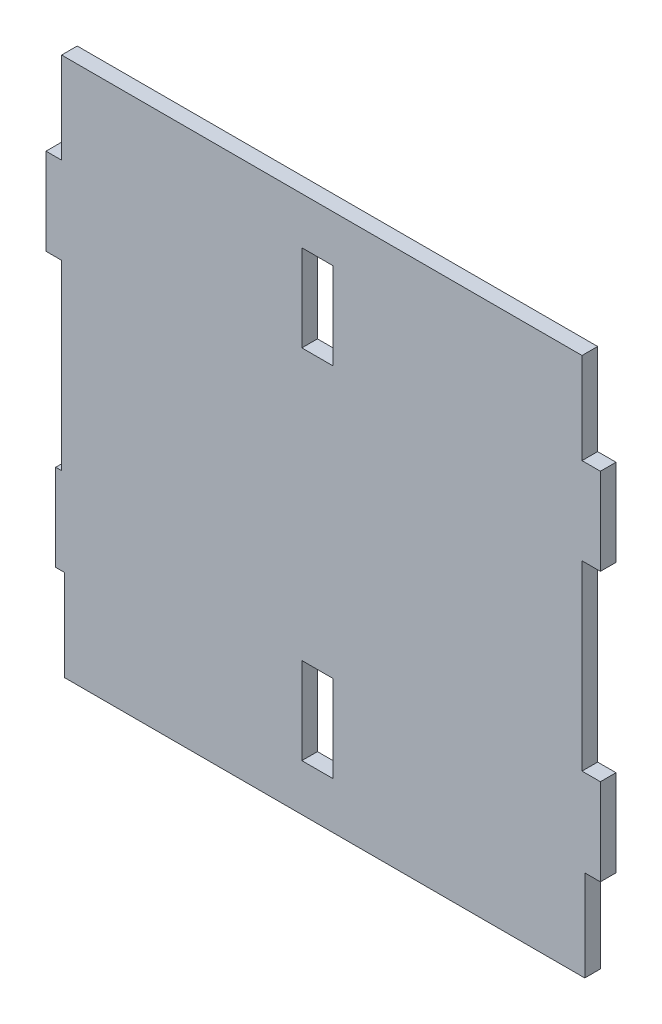
ISO-10303-21;
HEADER;
FILE_DESCRIPTION(('STEP AP214'),'2;1');
FILE_NAME('part.step','',(''),(''),'','','');
FILE_SCHEMA(('AUTOMOTIVE_DESIGN { 1 0 10303 214 1 1 1 1 }'));
ENDSEC;
DATA;
#1=APPLICATION_CONTEXT('core data for automotive mechanical design processes');
#2=APPLICATION_PROTOCOL_DEFINITION('international standard','automotive_design',2000,#1);
#3=PRODUCT_CONTEXT('',#1,'mechanical');
#4=PRODUCT('Part','Part','',(#3));
#5=PRODUCT_RELATED_PRODUCT_CATEGORY('part','',(#4));
#6=PRODUCT_DEFINITION_FORMATION('','',#4);
#7=PRODUCT_DEFINITION_CONTEXT('part definition',#1,'design');
#8=PRODUCT_DEFINITION('design','',#6,#7);
#9=PRODUCT_DEFINITION_SHAPE('','',#8);
#10=(LENGTH_UNIT() NAMED_UNIT(*) SI_UNIT(.MILLI.,.METRE.));
#11=(NAMED_UNIT(*) PLANE_ANGLE_UNIT() SI_UNIT($,.RADIAN.));
#12=(NAMED_UNIT(*) SI_UNIT($,.STERADIAN.) SOLID_ANGLE_UNIT());
#13=UNCERTAINTY_MEASURE_WITH_UNIT(LENGTH_MEASURE(1.E-05),#10,'distance_accuracy_value','');
#14=(GEOMETRIC_REPRESENTATION_CONTEXT(3) GLOBAL_UNCERTAINTY_ASSIGNED_CONTEXT((#13)) GLOBAL_UNIT_ASSIGNED_CONTEXT((#10,
#11,#12)) REPRESENTATION_CONTEXT('',''));
#15=CARTESIAN_POINT('',(0.,0.,0.));
#16=DIRECTION('',(0.,0.,1.));
#17=DIRECTION('',(1.,0.,0.));
#18=AXIS2_PLACEMENT_3D('',#15,#16,#17);
#19=CARTESIAN_POINT('',(0.,0.,18.));
#20=DIRECTION('',(0.,0.,1.));
#21=DIRECTION('',(1.,0.,0.));
#22=AXIS2_PLACEMENT_3D('',#19,#20,#21);
#23=PLANE('',#22);
#24=DIRECTION('',(-1.,0.,0.));
#25=VECTOR('',#24,1.);
#26=CARTESIAN_POINT('',(312.972181327121,-566.059001210979,18.));
#27=LINE('',#26,#25);
#28=CARTESIAN_POINT('',(312.972181327121,-566.059001210979,18.));
#29=VERTEX_POINT('',#28);
#30=CARTESIAN_POINT('',(276.972181327121,-566.059001210979,18.));
#31=VERTEX_POINT('',#30);
#32=EDGE_CURVE('E233',#29,#31,#27,.T.);
#33=ORIENTED_EDGE('',*,*,#32,.T.);
#34=DIRECTION('',(0.,1.,0.));
#35=VECTOR('',#34,1.);
#36=CARTESIAN_POINT('',(276.972181327121,-566.059001210979,18.));
#37=LINE('',#36,#35);
#38=CARTESIAN_POINT('',(276.972181327121,-466.059001210979,18.));
#39=VERTEX_POINT('',#38);
#40=EDGE_CURVE('E264',#31,#39,#37,.T.);
#41=ORIENTED_EDGE('',*,*,#40,.T.);
#42=DIRECTION('',(1.,0.,0.));
#43=VECTOR('',#42,1.);
#44=CARTESIAN_POINT('',(276.972181327121,-466.059001210979,18.));
#45=LINE('',#44,#43);
#46=CARTESIAN_POINT('',(312.972181327121,-466.059001210979,18.));
#47=VERTEX_POINT('',#46);
#48=EDGE_CURVE('E56',#39,#47,#45,.T.);
#49=ORIENTED_EDGE('',*,*,#48,.T.);
#50=DIRECTION('',(0.,1.,0.));
#51=VECTOR('',#50,1.);
#52=CARTESIAN_POINT('',(312.972181327121,-566.059001210979,18.));
#53=LINE('',#52,#51);
#54=EDGE_CURVE('E253',#29,#47,#53,.T.);
#55=ORIENTED_EDGE('',*,*,#54,.F.);
#56=EDGE_LOOP('',(#33,#41,#49,#55));
#57=FACE_BOUND('',#56,.T.);
#58=DIRECTION('',(0.,-1.,0.));
#59=VECTOR('',#58,1.);
#60=CARTESIAN_POINT('',(0.,0.,18.));
#61=LINE('',#60,#59);
#62=CARTESIAN_POINT('',(0.,0.,18.));
#63=VERTEX_POINT('',#62);
#64=CARTESIAN_POINT('',(0.,-105.,18.));
#65=VERTEX_POINT('',#64);
#66=EDGE_CURVE('E269',#63,#65,#61,.T.);
#67=ORIENTED_EDGE('',*,*,#66,.T.);
#68=DIRECTION('',(1.,0.,0.));
#69=VECTOR('',#68,1.);
#70=CARTESIAN_POINT('',(-18.,-105.,18.));
#71=LINE('',#70,#69);
#72=CARTESIAN_POINT('',(-18.,-105.,18.));
#73=VERTEX_POINT('',#72);
#74=EDGE_CURVE('E271',#73,#65,#71,.T.);
#75=ORIENTED_EDGE('',*,*,#74,.F.);
#76=DIRECTION('',(0.,-1.,0.));
#77=VECTOR('',#76,1.);
#78=CARTESIAN_POINT('',(-18.,-105.,18.));
#79=LINE('',#78,#77);
#80=CARTESIAN_POINT('',(-18.,-205.,18.));
#81=VERTEX_POINT('',#80);
#82=EDGE_CURVE('E275',#73,#81,#79,.T.);
#83=ORIENTED_EDGE('',*,*,#82,.T.);
#84=DIRECTION('',(1.,0.,0.));
#85=VECTOR('',#84,1.);
#86=CARTESIAN_POINT('',(-18.,-205.,18.));
#87=LINE('',#86,#85);
#88=CARTESIAN_POINT('',(0.,-205.,18.));
#89=VERTEX_POINT('',#88);
#90=EDGE_CURVE('E277',#81,#89,#87,.T.);
#91=ORIENTED_EDGE('',*,*,#90,.T.);
#92=DIRECTION('',(0.,-1.,0.));
#93=VECTOR('',#92,1.);
#94=CARTESIAN_POINT('',(0.,-205.,18.));
#95=LINE('',#94,#93);
#96=CARTESIAN_POINT('',(0.,-415.,18.));
#97=VERTEX_POINT('',#96);
#98=EDGE_CURVE('E279',#89,#97,#95,.T.);
#99=ORIENTED_EDGE('',*,*,#98,.T.);
#100=DIRECTION('',(1.,0.,0.));
#101=VECTOR('',#100,1.);
#102=CARTESIAN_POINT('',(-6.78008115735189,-415.,18.));
#103=LINE('',#102,#101);
#104=CARTESIAN_POINT('',(-6.78008115735189,-415.,18.));
#105=VERTEX_POINT('',#104);
#106=EDGE_CURVE('E281',#105,#97,#103,.T.);
#107=ORIENTED_EDGE('',*,*,#106,.F.);
#108=DIRECTION('',(0.,1.,0.));
#109=VECTOR('',#108,1.);
#110=CARTESIAN_POINT('',(-6.78008115735189,-515.,18.));
#111=LINE('',#110,#109);
#112=CARTESIAN_POINT('',(-6.78008115735189,-515.,18.));
#113=VERTEX_POINT('',#112);
#114=EDGE_CURVE('E284',#113,#105,#111,.T.);
#115=ORIENTED_EDGE('',*,*,#114,.F.);
#116=DIRECTION('',(0.999999666137457,0.000817144402291925,0.));
#117=VECTOR('',#116,1.);
#118=CARTESIAN_POINT('',(-6.78008115735189,-515.,18.));
#119=LINE('',#118,#117);
#120=CARTESIAN_POINT('',(3.17619678100274,-514.991864280499,18.));
#121=VERTEX_POINT('',#120);
#122=EDGE_CURVE('E287',#113,#121,#119,.T.);
#123=ORIENTED_EDGE('',*,*,#122,.T.);
#124=DIRECTION('',(0.,1.,0.));
#125=VECTOR('',#124,1.);
#126=CARTESIAN_POINT('',(3.17619678100274,-619.991864280499,18.));
#127=LINE('',#126,#125);
#128=CARTESIAN_POINT('',(3.17619678100274,-619.991864280499,18.));
#129=VERTEX_POINT('',#128);
#130=EDGE_CURVE('E289',#129,#121,#127,.T.);
#131=ORIENTED_EDGE('',*,*,#130,.F.);
#132=DIRECTION('',(1.,0.,0.));
#133=VECTOR('',#132,1.);
#134=CARTESIAN_POINT('',(3.17619678100274,-619.991864280499,18.));
#135=LINE('',#134,#133);
#136=CARTESIAN_POINT('',(603.176196781003,-619.991864280499,18.));
#137=VERTEX_POINT('',#136);
#138=EDGE_CURVE('E292',#129,#137,#135,.T.);
#139=ORIENTED_EDGE('',*,*,#138,.T.);
#140=DIRECTION('',(0.,1.,0.));
#141=VECTOR('',#140,1.);
#142=CARTESIAN_POINT('',(603.176196781003,-619.991864280499,18.));
#143=LINE('',#142,#141);
#144=CARTESIAN_POINT('',(603.176196781003,-515.,18.));
#145=VERTEX_POINT('',#144);
#146=EDGE_CURVE('E294',#137,#145,#143,.T.);
#147=ORIENTED_EDGE('',*,*,#146,.T.);
#148=DIRECTION('',(-1.,0.,0.));
#149=VECTOR('',#148,1.);
#150=CARTESIAN_POINT('',(621.176196781003,-515.,18.));
#151=LINE('',#150,#149);
#152=CARTESIAN_POINT('',(621.176196781003,-515.,18.));
#153=VERTEX_POINT('',#152);
#154=EDGE_CURVE('E296',#153,#145,#151,.T.);
#155=ORIENTED_EDGE('',*,*,#154,.F.);
#156=DIRECTION('',(0.,1.,0.));
#157=VECTOR('',#156,1.);
#158=CARTESIAN_POINT('',(621.176196781003,-515.,18.));
#159=LINE('',#158,#157);
#160=CARTESIAN_POINT('',(621.176196781003,-415.,18.));
#161=VERTEX_POINT('',#160);
#162=EDGE_CURVE('E299',#153,#161,#159,.T.);
#163=ORIENTED_EDGE('',*,*,#162,.T.);
#164=DIRECTION('',(-1.,0.,0.));
#165=VECTOR('',#164,1.);
#166=CARTESIAN_POINT('',(621.176196781003,-415.,18.));
#167=LINE('',#166,#165);
#168=CARTESIAN_POINT('',(600.,-415.,18.));
#169=VERTEX_POINT('',#168);
#170=EDGE_CURVE('E301',#161,#169,#167,.T.);
#171=ORIENTED_EDGE('',*,*,#170,.T.);
#172=DIRECTION('',(0.,-1.,0.));
#173=VECTOR('',#172,1.);
#174=CARTESIAN_POINT('',(600.,-205.,18.));
#175=LINE('',#174,#173);
#176=CARTESIAN_POINT('',(600.,-205.,18.));
#177=VERTEX_POINT('',#176);
#178=EDGE_CURVE('E303',#177,#169,#175,.T.);
#179=ORIENTED_EDGE('',*,*,#178,.F.);
#180=DIRECTION('',(-1.,0.,0.));
#181=VECTOR('',#180,1.);
#182=CARTESIAN_POINT('',(621.176196781003,-205.,18.));
#183=LINE('',#182,#181);
#184=CARTESIAN_POINT('',(621.176196781003,-205.,18.));
#185=VERTEX_POINT('',#184);
#186=EDGE_CURVE('E306',#185,#177,#183,.T.);
#187=ORIENTED_EDGE('',*,*,#186,.F.);
#188=DIRECTION('',(0.,-1.,0.));
#189=VECTOR('',#188,1.);
#190=CARTESIAN_POINT('',(621.176196781003,-105.,18.));
#191=LINE('',#190,#189);
#192=CARTESIAN_POINT('',(621.176196781003,-105.,18.));
#193=VERTEX_POINT('',#192);
#194=EDGE_CURVE('E309',#193,#185,#191,.T.);
#195=ORIENTED_EDGE('',*,*,#194,.F.);
#196=DIRECTION('',(-1.,0.,0.));
#197=VECTOR('',#196,1.);
#198=CARTESIAN_POINT('',(621.176196781003,-105.,18.));
#199=LINE('',#198,#197);
#200=CARTESIAN_POINT('',(600.,-105.,18.));
#201=VERTEX_POINT('',#200);
#202=EDGE_CURVE('E312',#193,#201,#199,.T.);
#203=ORIENTED_EDGE('',*,*,#202,.T.);
#204=DIRECTION('',(0.,-1.,0.));
#205=VECTOR('',#204,1.);
#206=CARTESIAN_POINT('',(600.,0.,18.));
#207=LINE('',#206,#205);
#208=CARTESIAN_POINT('',(600.,0.,18.));
#209=VERTEX_POINT('',#208);
#210=EDGE_CURVE('E314',#209,#201,#207,.T.);
#211=ORIENTED_EDGE('',*,*,#210,.F.);
#212=DIRECTION('',(-1.,0.,0.));
#213=VECTOR('',#212,1.);
#214=CARTESIAN_POINT('',(600.,0.,18.));
#215=LINE('',#214,#213);
#216=EDGE_CURVE('E317',#209,#63,#215,.T.);
#217=ORIENTED_EDGE('',*,*,#216,.T.);
#218=EDGE_LOOP('',(#67,#75,#83,#91,#99,#107,#115,#123,#131,#139,#147,#155,#163,#171,#179,#187,
#195,#203,#211,#217));
#219=FACE_BOUND('',#218,.T.);
#220=DIRECTION('',(1.,0.,0.));
#221=VECTOR('',#220,1.);
#222=CARTESIAN_POINT('',(276.972181327121,-153.940998789021,18.));
#223=LINE('',#222,#221);
#224=CARTESIAN_POINT('',(276.972181327121,-153.940998789021,18.));
#225=VERTEX_POINT('',#224);
#226=CARTESIAN_POINT('',(312.972181327121,-153.940998789021,18.));
#227=VERTEX_POINT('',#226);
#228=EDGE_CURVE('E232',#225,#227,#223,.T.);
#229=ORIENTED_EDGE('',*,*,#228,.F.);
#230=DIRECTION('',(0.,-1.,0.));
#231=VECTOR('',#230,1.);
#232=CARTESIAN_POINT('',(276.972181327121,-53.9409987890207,18.));
#233=LINE('',#232,#231);
#234=CARTESIAN_POINT('',(276.972181327121,-53.9409987890207,18.));
#235=VERTEX_POINT('',#234);
#236=EDGE_CURVE('E223',#235,#225,#233,.T.);
#237=ORIENTED_EDGE('',*,*,#236,.F.);
#238=DIRECTION('',(-1.,0.,0.));
#239=VECTOR('',#238,1.);
#240=CARTESIAN_POINT('',(312.972181327121,-53.9409987890207,18.));
#241=LINE('',#240,#239);
#242=CARTESIAN_POINT('',(312.972181327121,-53.9409987890207,18.));
#243=VERTEX_POINT('',#242);
#244=EDGE_CURVE('E243',#243,#235,#241,.T.);
#245=ORIENTED_EDGE('',*,*,#244,.F.);
#246=DIRECTION('',(0.,-1.,0.));
#247=VECTOR('',#246,1.);
#248=CARTESIAN_POINT('',(312.972181327121,-53.9409987890207,18.));
#249=LINE('',#248,#247);
#250=EDGE_CURVE('E48',#243,#227,#249,.T.);
#251=ORIENTED_EDGE('',*,*,#250,.T.);
#252=EDGE_LOOP('',(#229,#237,#245,#251));
#253=FACE_BOUND('',#252,.T.);
#254=ADVANCED_FACE('F33',(#57,#219,#253),#23,.T.);
#255=CARTESIAN_POINT('',(0.,0.,0.));
#256=DIRECTION('',(0.,0.,1.));
#257=DIRECTION('',(1.,0.,0.));
#258=AXIS2_PLACEMENT_3D('',#255,#256,#257);
#259=PLANE('',#258);
#260=DIRECTION('',(0.,-1.,0.));
#261=VECTOR('',#260,1.);
#262=CARTESIAN_POINT('',(0.,0.,0.));
#263=LINE('',#262,#261);
#264=CARTESIAN_POINT('',(0.,0.,0.));
#265=VERTEX_POINT('',#264);
#266=CARTESIAN_POINT('',(0.,-105.,0.));
#267=VERTEX_POINT('',#266);
#268=EDGE_CURVE('E239',#265,#267,#263,.T.);
#269=ORIENTED_EDGE('',*,*,#268,.F.);
#270=DIRECTION('',(-1.,0.,0.));
#271=VECTOR('',#270,1.);
#272=CARTESIAN_POINT('',(600.,0.,0.));
#273=LINE('',#272,#271);
#274=CARTESIAN_POINT('',(600.,0.,0.));
#275=VERTEX_POINT('',#274);
#276=EDGE_CURVE('E272',#275,#265,#273,.T.);
#277=ORIENTED_EDGE('',*,*,#276,.F.);
#278=DIRECTION('',(0.,-1.,0.));
#279=VECTOR('',#278,1.);
#280=CARTESIAN_POINT('',(600.,0.,0.));
#281=LINE('',#280,#279);
#282=CARTESIAN_POINT('',(600.,-105.,0.));
#283=VERTEX_POINT('',#282);
#284=EDGE_CURVE('E369',#275,#283,#281,.T.);
#285=ORIENTED_EDGE('',*,*,#284,.T.);
#286=DIRECTION('',(-1.,0.,0.));
#287=VECTOR('',#286,1.);
#288=CARTESIAN_POINT('',(621.176196781003,-105.,0.));
#289=LINE('',#288,#287);
#290=CARTESIAN_POINT('',(621.176196781003,-105.,0.));
#291=VERTEX_POINT('',#290);
#292=EDGE_CURVE('E366',#291,#283,#289,.T.);
#293=ORIENTED_EDGE('',*,*,#292,.F.);
#294=DIRECTION('',(0.,-1.,0.));
#295=VECTOR('',#294,1.);
#296=CARTESIAN_POINT('',(621.176196781003,-105.,0.));
#297=LINE('',#296,#295);
#298=CARTESIAN_POINT('',(621.176196781003,-205.,0.));
#299=VERTEX_POINT('',#298);
#300=EDGE_CURVE('E363',#291,#299,#297,.T.);
#301=ORIENTED_EDGE('',*,*,#300,.T.);
#302=DIRECTION('',(-1.,0.,0.));
#303=VECTOR('',#302,1.);
#304=CARTESIAN_POINT('',(621.176196781003,-205.,0.));
#305=LINE('',#304,#303);
#306=CARTESIAN_POINT('',(600.,-205.,0.));
#307=VERTEX_POINT('',#306);
#308=EDGE_CURVE('E360',#299,#307,#305,.T.);
#309=ORIENTED_EDGE('',*,*,#308,.T.);
#310=DIRECTION('',(0.,-1.,0.));
#311=VECTOR('',#310,1.);
#312=CARTESIAN_POINT('',(600.,-205.,0.));
#313=LINE('',#312,#311);
#314=CARTESIAN_POINT('',(600.,-415.,0.));
#315=VERTEX_POINT('',#314);
#316=EDGE_CURVE('E357',#307,#315,#313,.T.);
#317=ORIENTED_EDGE('',*,*,#316,.T.);
#318=DIRECTION('',(-1.,0.,0.));
#319=VECTOR('',#318,1.);
#320=CARTESIAN_POINT('',(621.176196781003,-415.,0.));
#321=LINE('',#320,#319);
#322=CARTESIAN_POINT('',(621.176196781003,-415.,0.));
#323=VERTEX_POINT('',#322);
#324=EDGE_CURVE('E354',#323,#315,#321,.T.);
#325=ORIENTED_EDGE('',*,*,#324,.F.);
#326=DIRECTION('',(0.,1.,0.));
#327=VECTOR('',#326,1.);
#328=CARTESIAN_POINT('',(621.176196781003,-515.,0.));
#329=LINE('',#328,#327);
#330=CARTESIAN_POINT('',(621.176196781003,-515.,0.));
#331=VERTEX_POINT('',#330);
#332=EDGE_CURVE('E352',#331,#323,#329,.T.);
#333=ORIENTED_EDGE('',*,*,#332,.F.);
#334=DIRECTION('',(-1.,0.,0.));
#335=VECTOR('',#334,1.);
#336=CARTESIAN_POINT('',(621.176196781003,-515.,0.));
#337=LINE('',#336,#335);
#338=CARTESIAN_POINT('',(603.176196781003,-515.,0.));
#339=VERTEX_POINT('',#338);
#340=EDGE_CURVE('E349',#331,#339,#337,.T.);
#341=ORIENTED_EDGE('',*,*,#340,.T.);
#342=DIRECTION('',(0.,1.,0.));
#343=VECTOR('',#342,1.);
#344=CARTESIAN_POINT('',(603.176196781003,-619.991864280499,0.));
#345=LINE('',#344,#343);
#346=CARTESIAN_POINT('',(603.176196781003,-619.991864280499,0.));
#347=VERTEX_POINT('',#346);
#348=EDGE_CURVE('E346',#347,#339,#345,.T.);
#349=ORIENTED_EDGE('',*,*,#348,.F.);
#350=DIRECTION('',(1.,0.,0.));
#351=VECTOR('',#350,1.);
#352=CARTESIAN_POINT('',(3.17619678100274,-619.991864280499,0.));
#353=LINE('',#352,#351);
#354=CARTESIAN_POINT('',(3.17619678100274,-619.991864280499,0.));
#355=VERTEX_POINT('',#354);
#356=EDGE_CURVE('E344',#355,#347,#353,.T.);
#357=ORIENTED_EDGE('',*,*,#356,.F.);
#358=DIRECTION('',(0.,1.,0.));
#359=VECTOR('',#358,1.);
#360=CARTESIAN_POINT('',(3.17619678100274,-619.991864280499,0.));
#361=LINE('',#360,#359);
#362=CARTESIAN_POINT('',(3.17619678100274,-514.991864280499,0.));
#363=VERTEX_POINT('',#362);
#364=EDGE_CURVE('E341',#355,#363,#361,.T.);
#365=ORIENTED_EDGE('',*,*,#364,.T.);
#366=DIRECTION('',(0.999999666137457,0.000817144402291925,0.));
#367=VECTOR('',#366,1.);
#368=CARTESIAN_POINT('',(-6.78008115735189,-515.,0.));
#369=LINE('',#368,#367);
#370=CARTESIAN_POINT('',(-6.78008115735189,-515.,0.));
#371=VERTEX_POINT('',#370);
#372=EDGE_CURVE('E338',#371,#363,#369,.T.);
#373=ORIENTED_EDGE('',*,*,#372,.F.);
#374=DIRECTION('',(0.,1.,0.));
#375=VECTOR('',#374,1.);
#376=CARTESIAN_POINT('',(-6.78008115735189,-515.,0.));
#377=LINE('',#376,#375);
#378=CARTESIAN_POINT('',(-6.78008115735189,-415.,0.));
#379=VERTEX_POINT('',#378);
#380=EDGE_CURVE('E335',#371,#379,#377,.T.);
#381=ORIENTED_EDGE('',*,*,#380,.T.);
#382=DIRECTION('',(1.,0.,0.));
#383=VECTOR('',#382,1.);
#384=CARTESIAN_POINT('',(-6.78008115735189,-415.,0.));
#385=LINE('',#384,#383);
#386=CARTESIAN_POINT('',(0.,-415.,0.));
#387=VERTEX_POINT('',#386);
#388=EDGE_CURVE('E332',#379,#387,#385,.T.);
#389=ORIENTED_EDGE('',*,*,#388,.T.);
#390=DIRECTION('',(0.,-1.,0.));
#391=VECTOR('',#390,1.);
#392=CARTESIAN_POINT('',(0.,-205.,0.));
#393=LINE('',#392,#391);
#394=CARTESIAN_POINT('',(0.,-205.,0.));
#395=VERTEX_POINT('',#394);
#396=EDGE_CURVE('E329',#395,#387,#393,.T.);
#397=ORIENTED_EDGE('',*,*,#396,.F.);
#398=DIRECTION('',(1.,0.,0.));
#399=VECTOR('',#398,1.);
#400=CARTESIAN_POINT('',(-18.,-205.,0.));
#401=LINE('',#400,#399);
#402=CARTESIAN_POINT('',(-18.,-205.,0.));
#403=VERTEX_POINT('',#402);
#404=EDGE_CURVE('E327',#403,#395,#401,.T.);
#405=ORIENTED_EDGE('',*,*,#404,.F.);
#406=DIRECTION('',(0.,-1.,0.));
#407=VECTOR('',#406,1.);
#408=CARTESIAN_POINT('',(-18.,-105.,0.));
#409=LINE('',#408,#407);
#410=CARTESIAN_POINT('',(-18.,-105.,0.));
#411=VERTEX_POINT('',#410);
#412=EDGE_CURVE('E325',#411,#403,#409,.T.);
#413=ORIENTED_EDGE('',*,*,#412,.F.);
#414=DIRECTION('',(1.,0.,0.));
#415=VECTOR('',#414,1.);
#416=CARTESIAN_POINT('',(-18.,-105.,0.));
#417=LINE('',#416,#415);
#418=EDGE_CURVE('E322',#411,#267,#417,.T.);
#419=ORIENTED_EDGE('',*,*,#418,.T.);
#420=EDGE_LOOP('',(#269,#277,#285,#293,#301,#309,#317,#325,#333,#341,#349,#357,#365,#373,#381,
#389,#397,#405,#413,#419));
#421=FACE_BOUND('',#420,.T.);
#422=DIRECTION('',(0.,-1.,0.));
#423=VECTOR('',#422,1.);
#424=CARTESIAN_POINT('',(276.972181327121,0.,0.));
#425=LINE('',#424,#423);
#426=CARTESIAN_POINT('',(276.972181327121,-466.059001210979,0.));
#427=VERTEX_POINT('',#426);
#428=CARTESIAN_POINT('',(276.972181327121,-566.059001210979,0.));
#429=VERTEX_POINT('',#428);
#430=EDGE_CURVE('E417',#427,#429,#425,.T.);
#431=ORIENTED_EDGE('',*,*,#430,.T.);
#432=DIRECTION('',(1.,0.,0.));
#433=VECTOR('',#432,1.);
#434=CARTESIAN_POINT('',(0.,-566.059001210979,0.));
#435=LINE('',#434,#433);
#436=CARTESIAN_POINT('',(312.972181327121,-566.059001210979,0.));
#437=VERTEX_POINT('',#436);
#438=EDGE_CURVE('E425',#429,#437,#435,.T.);
#439=ORIENTED_EDGE('',*,*,#438,.T.);
#440=DIRECTION('',(0.,-1.,0.));
#441=VECTOR('',#440,1.);
#442=CARTESIAN_POINT('',(312.972181327121,0.,0.));
#443=LINE('',#442,#441);
#444=CARTESIAN_POINT('',(312.972181327121,-466.059001210979,0.));
#445=VERTEX_POINT('',#444);
#446=EDGE_CURVE('E423',#445,#437,#443,.T.);
#447=ORIENTED_EDGE('',*,*,#446,.F.);
#448=DIRECTION('',(-1.,0.,0.));
#449=VECTOR('',#448,1.);
#450=CARTESIAN_POINT('',(0.,-466.059001210979,0.));
#451=LINE('',#450,#449);
#452=EDGE_CURVE('E420',#445,#427,#451,.T.);
#453=ORIENTED_EDGE('',*,*,#452,.T.);
#454=EDGE_LOOP('',(#431,#439,#447,#453));
#455=FACE_BOUND('',#454,.T.);
#456=DIRECTION('',(0.,1.,0.));
#457=VECTOR('',#456,1.);
#458=CARTESIAN_POINT('',(276.972181327121,0.,0.));
#459=LINE('',#458,#457);
#460=CARTESIAN_POINT('',(276.972181327121,-153.940998789021,0.));
#461=VERTEX_POINT('',#460);
#462=CARTESIAN_POINT('',(276.972181327121,-53.9409987890207,0.));
#463=VERTEX_POINT('',#462);
#464=EDGE_CURVE('E11',#461,#463,#459,.T.);
#465=ORIENTED_EDGE('',*,*,#464,.F.);
#466=DIRECTION('',(-1.,0.,0.));
#467=VECTOR('',#466,1.);
#468=CARTESIAN_POINT('',(0.,-153.940998789021,0.));
#469=LINE('',#468,#467);
#470=CARTESIAN_POINT('',(312.972181327121,-153.940998789021,0.));
#471=VERTEX_POINT('',#470);
#472=EDGE_CURVE('E41',#471,#461,#469,.T.);
#473=ORIENTED_EDGE('',*,*,#472,.F.);
#474=DIRECTION('',(0.,1.,0.));
#475=VECTOR('',#474,1.);
#476=CARTESIAN_POINT('',(312.972181327121,0.,0.));
#477=LINE('',#476,#475);
#478=CARTESIAN_POINT('',(312.972181327121,-53.9409987890207,0.));
#479=VERTEX_POINT('',#478);
#480=EDGE_CURVE('E430',#471,#479,#477,.T.);
#481=ORIENTED_EDGE('',*,*,#480,.T.);
#482=DIRECTION('',(1.,0.,0.));
#483=VECTOR('',#482,1.);
#484=CARTESIAN_POINT('',(0.,-53.9409987890207,0.));
#485=LINE('',#484,#483);
#486=EDGE_CURVE('E428',#463,#479,#485,.T.);
#487=ORIENTED_EDGE('',*,*,#486,.F.);
#488=EDGE_LOOP('',(#465,#473,#481,#487));
#489=FACE_BOUND('',#488,.T.);
#490=ADVANCED_FACE('F434',(#421,#455,#489),#259,.F.);
#491=CARTESIAN_POINT('',(0.,0.,18.));
#492=DIRECTION('',(1.,0.,0.));
#493=DIRECTION('',(0.,1.,0.));
#494=AXIS2_PLACEMENT_3D('',#491,#492,#493);
#495=PLANE('',#494);
#496=ORIENTED_EDGE('',*,*,#268,.T.);
#497=DIRECTION('',(0.,0.,-1.));
#498=VECTOR('',#497,1.);
#499=CARTESIAN_POINT('',(0.,-105.,18.));
#500=LINE('',#499,#498);
#501=EDGE_CURVE('E415',#65,#267,#500,.T.);
#502=ORIENTED_EDGE('',*,*,#501,.F.);
#503=ORIENTED_EDGE('',*,*,#66,.F.);
#504=DIRECTION('',(0.,0.,-1.));
#505=VECTOR('',#504,1.);
#506=CARTESIAN_POINT('',(0.,0.,18.));
#507=LINE('',#506,#505);
#508=EDGE_CURVE('E319',#63,#265,#507,.T.);
#509=ORIENTED_EDGE('',*,*,#508,.T.);
#510=EDGE_LOOP('',(#496,#502,#503,#509));
#511=FACE_BOUND('',#510,.T.);
#512=ADVANCED_FACE('F35',(#511),#495,.F.);
#513=CARTESIAN_POINT('',(-18.,-105.,18.));
#514=DIRECTION('',(0.,1.,0.));
#515=DIRECTION('',(0.,0.,1.));
#516=AXIS2_PLACEMENT_3D('',#513,#514,#515);
#517=PLANE('',#516);
#518=ORIENTED_EDGE('',*,*,#418,.F.);
#519=DIRECTION('',(0.,0.,-1.));
#520=VECTOR('',#519,1.);
#521=CARTESIAN_POINT('',(-18.,-105.,18.));
#522=LINE('',#521,#520);
#523=EDGE_CURVE('E413',#73,#411,#522,.T.);
#524=ORIENTED_EDGE('',*,*,#523,.F.);
#525=ORIENTED_EDGE('',*,*,#74,.T.);
#526=ORIENTED_EDGE('',*,*,#501,.T.);
#527=EDGE_LOOP('',(#518,#524,#525,#526));
#528=FACE_BOUND('',#527,.T.);
#529=ADVANCED_FACE('F528',(#528),#517,.T.);
#530=CARTESIAN_POINT('',(-18.,-105.,18.));
#531=DIRECTION('',(1.,0.,0.));
#532=DIRECTION('',(0.,1.,0.));
#533=AXIS2_PLACEMENT_3D('',#530,#531,#532);
#534=PLANE('',#533);
#535=ORIENTED_EDGE('',*,*,#412,.T.);
#536=DIRECTION('',(0.,0.,-1.));
#537=VECTOR('',#536,1.);
#538=CARTESIAN_POINT('',(-18.,-205.,18.));
#539=LINE('',#538,#537);
#540=EDGE_CURVE('E410',#81,#403,#539,.T.);
#541=ORIENTED_EDGE('',*,*,#540,.F.);
#542=ORIENTED_EDGE('',*,*,#82,.F.);
#543=ORIENTED_EDGE('',*,*,#523,.T.);
#544=EDGE_LOOP('',(#535,#541,#542,#543));
#545=FACE_BOUND('',#544,.T.);
#546=ADVANCED_FACE('F525',(#545),#534,.F.);
#547=CARTESIAN_POINT('',(-18.,-205.,18.));
#548=DIRECTION('',(0.,1.,0.));
#549=DIRECTION('',(0.,0.,1.));
#550=AXIS2_PLACEMENT_3D('',#547,#548,#549);
#551=PLANE('',#550);
#552=ORIENTED_EDGE('',*,*,#404,.T.);
#553=DIRECTION('',(0.,0.,-1.));
#554=VECTOR('',#553,1.);
#555=CARTESIAN_POINT('',(0.,-205.,18.));
#556=LINE('',#555,#554);
#557=EDGE_CURVE('E407',#89,#395,#556,.T.);
#558=ORIENTED_EDGE('',*,*,#557,.F.);
#559=ORIENTED_EDGE('',*,*,#90,.F.);
#560=ORIENTED_EDGE('',*,*,#540,.T.);
#561=EDGE_LOOP('',(#552,#558,#559,#560));
#562=FACE_BOUND('',#561,.T.);
#563=ADVANCED_FACE('F521',(#562),#551,.F.);
#564=CARTESIAN_POINT('',(0.,-205.,18.));
#565=DIRECTION('',(1.,0.,0.));
#566=DIRECTION('',(0.,1.,0.));
#567=AXIS2_PLACEMENT_3D('',#564,#565,#566);
#568=PLANE('',#567);
#569=ORIENTED_EDGE('',*,*,#396,.T.);
#570=DIRECTION('',(0.,0.,-1.));
#571=VECTOR('',#570,1.);
#572=CARTESIAN_POINT('',(0.,-415.,18.));
#573=LINE('',#572,#571);
#574=EDGE_CURVE('E405',#97,#387,#573,.T.);
#575=ORIENTED_EDGE('',*,*,#574,.F.);
#576=ORIENTED_EDGE('',*,*,#98,.F.);
#577=ORIENTED_EDGE('',*,*,#557,.T.);
#578=EDGE_LOOP('',(#569,#575,#576,#577));
#579=FACE_BOUND('',#578,.T.);
#580=ADVANCED_FACE('F517',(#579),#568,.F.);
#581=CARTESIAN_POINT('',(-6.78008115735189,-415.,18.));
#582=DIRECTION('',(0.,1.,0.));
#583=DIRECTION('',(0.,0.,1.));
#584=AXIS2_PLACEMENT_3D('',#581,#582,#583);
#585=PLANE('',#584);
#586=ORIENTED_EDGE('',*,*,#388,.F.);
#587=DIRECTION('',(0.,0.,-1.));
#588=VECTOR('',#587,1.);
#589=CARTESIAN_POINT('',(-6.78008115735189,-415.,18.));
#590=LINE('',#589,#588);
#591=EDGE_CURVE('E403',#105,#379,#590,.T.);
#592=ORIENTED_EDGE('',*,*,#591,.F.);
#593=ORIENTED_EDGE('',*,*,#106,.T.);
#594=ORIENTED_EDGE('',*,*,#574,.T.);
#595=EDGE_LOOP('',(#586,#592,#593,#594));
#596=FACE_BOUND('',#595,.T.);
#597=ADVANCED_FACE('F513',(#596),#585,.T.);
#598=CARTESIAN_POINT('',(-6.78008115735189,-515.,18.));
#599=DIRECTION('',(-1.,0.,0.));
#600=DIRECTION('',(0.,0.,1.));
#601=AXIS2_PLACEMENT_3D('',#598,#599,#600);
#602=PLANE('',#601);
#603=ORIENTED_EDGE('',*,*,#380,.F.);
#604=DIRECTION('',(0.,0.,-1.));
#605=VECTOR('',#604,1.);
#606=CARTESIAN_POINT('',(-6.78008115735189,-515.,18.));
#607=LINE('',#606,#605);
#608=EDGE_CURVE('E401',#113,#371,#607,.T.);
#609=ORIENTED_EDGE('',*,*,#608,.F.);
#610=ORIENTED_EDGE('',*,*,#114,.T.);
#611=ORIENTED_EDGE('',*,*,#591,.T.);
#612=EDGE_LOOP('',(#603,#609,#610,#611));
#613=FACE_BOUND('',#612,.T.);
#614=ADVANCED_FACE('F509',(#613),#602,.T.);
#615=CARTESIAN_POINT('',(-6.78008115735189,-515.,18.));
#616=DIRECTION('',(-0.000817144402291925,0.999999666137457,0.));
#617=DIRECTION('',(-0.999999666137457,-0.000817144402291925,0.));
#618=AXIS2_PLACEMENT_3D('',#615,#616,#617);
#619=PLANE('',#618);
#620=ORIENTED_EDGE('',*,*,#372,.T.);
#621=DIRECTION('',(0.,0.,-1.));
#622=VECTOR('',#621,1.);
#623=CARTESIAN_POINT('',(3.17619678100274,-514.991864280499,18.));
#624=LINE('',#623,#622);
#625=EDGE_CURVE('E399',#121,#363,#624,.T.);
#626=ORIENTED_EDGE('',*,*,#625,.F.);
#627=ORIENTED_EDGE('',*,*,#122,.F.);
#628=ORIENTED_EDGE('',*,*,#608,.T.);
#629=EDGE_LOOP('',(#620,#626,#627,#628));
#630=FACE_BOUND('',#629,.T.);
#631=ADVANCED_FACE('F505',(#630),#619,.F.);
#632=CARTESIAN_POINT('',(3.17619678100274,-619.991864280499,18.));
#633=DIRECTION('',(-1.,0.,0.));
#634=DIRECTION('',(0.,0.,1.));
#635=AXIS2_PLACEMENT_3D('',#632,#633,#634);
#636=PLANE('',#635);
#637=ORIENTED_EDGE('',*,*,#364,.F.);
#638=DIRECTION('',(0.,0.,-1.));
#639=VECTOR('',#638,1.);
#640=CARTESIAN_POINT('',(3.17619678100274,-619.991864280499,18.));
#641=LINE('',#640,#639);
#642=EDGE_CURVE('E397',#129,#355,#641,.T.);
#643=ORIENTED_EDGE('',*,*,#642,.F.);
#644=ORIENTED_EDGE('',*,*,#130,.T.);
#645=ORIENTED_EDGE('',*,*,#625,.T.);
#646=EDGE_LOOP('',(#637,#643,#644,#645));
#647=FACE_BOUND('',#646,.T.);
#648=ADVANCED_FACE('F501',(#647),#636,.T.);
#649=CARTESIAN_POINT('',(3.17619678100274,-619.991864280499,18.));
#650=DIRECTION('',(0.,1.,0.));
#651=DIRECTION('',(-1.,0.,0.));
#652=AXIS2_PLACEMENT_3D('',#649,#650,#651);
#653=PLANE('',#652);
#654=ORIENTED_EDGE('',*,*,#356,.T.);
#655=DIRECTION('',(0.,0.,-1.));
#656=VECTOR('',#655,1.);
#657=CARTESIAN_POINT('',(603.176196781003,-619.991864280499,18.));
#658=LINE('',#657,#656);
#659=EDGE_CURVE('E394',#137,#347,#658,.T.);
#660=ORIENTED_EDGE('',*,*,#659,.F.);
#661=ORIENTED_EDGE('',*,*,#138,.F.);
#662=ORIENTED_EDGE('',*,*,#642,.T.);
#663=EDGE_LOOP('',(#654,#660,#661,#662));
#664=FACE_BOUND('',#663,.T.);
#665=ADVANCED_FACE('F497',(#664),#653,.F.);
#666=CARTESIAN_POINT('',(603.176196781003,-619.991864280499,18.));
#667=DIRECTION('',(-1.,0.,0.));
#668=DIRECTION('',(0.,0.,1.));
#669=AXIS2_PLACEMENT_3D('',#666,#667,#668);
#670=PLANE('',#669);
#671=ORIENTED_EDGE('',*,*,#348,.T.);
#672=DIRECTION('',(0.,0.,-1.));
#673=VECTOR('',#672,1.);
#674=CARTESIAN_POINT('',(603.176196781003,-515.,18.));
#675=LINE('',#674,#673);
#676=EDGE_CURVE('E392',#145,#339,#675,.T.);
#677=ORIENTED_EDGE('',*,*,#676,.F.);
#678=ORIENTED_EDGE('',*,*,#146,.F.);
#679=ORIENTED_EDGE('',*,*,#659,.T.);
#680=EDGE_LOOP('',(#671,#677,#678,#679));
#681=FACE_BOUND('',#680,.T.);
#682=ADVANCED_FACE('F493',(#681),#670,.F.);
#683=CARTESIAN_POINT('',(621.176196781003,-515.,18.));
#684=DIRECTION('',(0.,-1.,0.));
#685=DIRECTION('',(0.,0.,-1.));
#686=AXIS2_PLACEMENT_3D('',#683,#684,#685);
#687=PLANE('',#686);
#688=ORIENTED_EDGE('',*,*,#340,.F.);
#689=DIRECTION('',(0.,0.,-1.));
#690=VECTOR('',#689,1.);
#691=CARTESIAN_POINT('',(621.176196781003,-515.,18.));
#692=LINE('',#691,#690);
#693=EDGE_CURVE('E390',#153,#331,#692,.T.);
#694=ORIENTED_EDGE('',*,*,#693,.F.);
#695=ORIENTED_EDGE('',*,*,#154,.T.);
#696=ORIENTED_EDGE('',*,*,#676,.T.);
#697=EDGE_LOOP('',(#688,#694,#695,#696));
#698=FACE_BOUND('',#697,.T.);
#699=ADVANCED_FACE('F489',(#698),#687,.T.);
#700=CARTESIAN_POINT('',(621.176196781003,-515.,18.));
#701=DIRECTION('',(-1.,0.,0.));
#702=DIRECTION('',(0.,0.,1.));
#703=AXIS2_PLACEMENT_3D('',#700,#701,#702);
#704=PLANE('',#703);
#705=ORIENTED_EDGE('',*,*,#332,.T.);
#706=DIRECTION('',(0.,0.,-1.));
#707=VECTOR('',#706,1.);
#708=CARTESIAN_POINT('',(621.176196781003,-415.,18.));
#709=LINE('',#708,#707);
#710=EDGE_CURVE('E387',#161,#323,#709,.T.);
#711=ORIENTED_EDGE('',*,*,#710,.F.);
#712=ORIENTED_EDGE('',*,*,#162,.F.);
#713=ORIENTED_EDGE('',*,*,#693,.T.);
#714=EDGE_LOOP('',(#705,#711,#712,#713));
#715=FACE_BOUND('',#714,.T.);
#716=ADVANCED_FACE('F485',(#715),#704,.F.);
#717=CARTESIAN_POINT('',(621.176196781003,-415.,18.));
#718=DIRECTION('',(0.,-1.,0.));
#719=DIRECTION('',(0.,0.,-1.));
#720=AXIS2_PLACEMENT_3D('',#717,#718,#719);
#721=PLANE('',#720);
#722=ORIENTED_EDGE('',*,*,#324,.T.);
#723=DIRECTION('',(0.,0.,-1.));
#724=VECTOR('',#723,1.);
#725=CARTESIAN_POINT('',(600.,-415.,18.));
#726=LINE('',#725,#724);
#727=EDGE_CURVE('E385',#169,#315,#726,.T.);
#728=ORIENTED_EDGE('',*,*,#727,.F.);
#729=ORIENTED_EDGE('',*,*,#170,.F.);
#730=ORIENTED_EDGE('',*,*,#710,.T.);
#731=EDGE_LOOP('',(#722,#728,#729,#730));
#732=FACE_BOUND('',#731,.T.);
#733=ADVANCED_FACE('F481',(#732),#721,.F.);
#734=CARTESIAN_POINT('',(600.,-205.,18.));
#735=DIRECTION('',(1.,0.,0.));
#736=DIRECTION('',(0.,1.,0.));
#737=AXIS2_PLACEMENT_3D('',#734,#735,#736);
#738=PLANE('',#737);
#739=ORIENTED_EDGE('',*,*,#316,.F.);
#740=DIRECTION('',(0.,0.,-1.));
#741=VECTOR('',#740,1.);
#742=CARTESIAN_POINT('',(600.,-205.,18.));
#743=LINE('',#742,#741);
#744=EDGE_CURVE('E383',#177,#307,#743,.T.);
#745=ORIENTED_EDGE('',*,*,#744,.F.);
#746=ORIENTED_EDGE('',*,*,#178,.T.);
#747=ORIENTED_EDGE('',*,*,#727,.T.);
#748=EDGE_LOOP('',(#739,#745,#746,#747));
#749=FACE_BOUND('',#748,.T.);
#750=ADVANCED_FACE('F477',(#749),#738,.T.);
#751=CARTESIAN_POINT('',(621.176196781003,-205.,18.));
#752=DIRECTION('',(0.,-1.,0.));
#753=DIRECTION('',(0.,0.,-1.));
#754=AXIS2_PLACEMENT_3D('',#751,#752,#753);
#755=PLANE('',#754);
#756=ORIENTED_EDGE('',*,*,#308,.F.);
#757=DIRECTION('',(0.,0.,-1.));
#758=VECTOR('',#757,1.);
#759=CARTESIAN_POINT('',(621.176196781003,-205.,18.));
#760=LINE('',#759,#758);
#761=EDGE_CURVE('E381',#185,#299,#760,.T.);
#762=ORIENTED_EDGE('',*,*,#761,.F.);
#763=ORIENTED_EDGE('',*,*,#186,.T.);
#764=ORIENTED_EDGE('',*,*,#744,.T.);
#765=EDGE_LOOP('',(#756,#762,#763,#764));
#766=FACE_BOUND('',#765,.T.);
#767=ADVANCED_FACE('F473',(#766),#755,.T.);
#768=CARTESIAN_POINT('',(621.176196781003,-105.,18.));
#769=DIRECTION('',(1.,0.,0.));
#770=DIRECTION('',(0.,0.,-1.));
#771=AXIS2_PLACEMENT_3D('',#768,#769,#770);
#772=PLANE('',#771);
#773=ORIENTED_EDGE('',*,*,#300,.F.);
#774=DIRECTION('',(0.,0.,-1.));
#775=VECTOR('',#774,1.);
#776=CARTESIAN_POINT('',(621.176196781003,-105.,18.));
#777=LINE('',#776,#775);
#778=EDGE_CURVE('E379',#193,#291,#777,.T.);
#779=ORIENTED_EDGE('',*,*,#778,.F.);
#780=ORIENTED_EDGE('',*,*,#194,.T.);
#781=ORIENTED_EDGE('',*,*,#761,.T.);
#782=EDGE_LOOP('',(#773,#779,#780,#781));
#783=FACE_BOUND('',#782,.T.);
#784=ADVANCED_FACE('F469',(#783),#772,.T.);
#785=CARTESIAN_POINT('',(621.176196781003,-105.,18.));
#786=DIRECTION('',(0.,-1.,0.));
#787=DIRECTION('',(0.,0.,-1.));
#788=AXIS2_PLACEMENT_3D('',#785,#786,#787);
#789=PLANE('',#788);
#790=ORIENTED_EDGE('',*,*,#292,.T.);
#791=DIRECTION('',(0.,0.,-1.));
#792=VECTOR('',#791,1.);
#793=CARTESIAN_POINT('',(600.,-105.,18.));
#794=LINE('',#793,#792);
#795=EDGE_CURVE('E377',#201,#283,#794,.T.);
#796=ORIENTED_EDGE('',*,*,#795,.F.);
#797=ORIENTED_EDGE('',*,*,#202,.F.);
#798=ORIENTED_EDGE('',*,*,#778,.T.);
#799=EDGE_LOOP('',(#790,#796,#797,#798));
#800=FACE_BOUND('',#799,.T.);
#801=ADVANCED_FACE('F465',(#800),#789,.F.);
#802=CARTESIAN_POINT('',(600.,0.,18.));
#803=DIRECTION('',(1.,0.,0.));
#804=DIRECTION('',(0.,0.,-1.));
#805=AXIS2_PLACEMENT_3D('',#802,#803,#804);
#806=PLANE('',#805);
#807=ORIENTED_EDGE('',*,*,#284,.F.);
#808=DIRECTION('',(0.,0.,-1.));
#809=VECTOR('',#808,1.);
#810=CARTESIAN_POINT('',(600.,0.,18.));
#811=LINE('',#810,#809);
#812=EDGE_CURVE('E375',#209,#275,#811,.T.);
#813=ORIENTED_EDGE('',*,*,#812,.F.);
#814=ORIENTED_EDGE('',*,*,#210,.T.);
#815=ORIENTED_EDGE('',*,*,#795,.T.);
#816=EDGE_LOOP('',(#807,#813,#814,#815));
#817=FACE_BOUND('',#816,.T.);
#818=ADVANCED_FACE('F461',(#817),#806,.T.);
#819=CARTESIAN_POINT('',(600.,0.,18.));
#820=DIRECTION('',(0.,-1.,0.));
#821=DIRECTION('',(0.,0.,-1.));
#822=AXIS2_PLACEMENT_3D('',#819,#820,#821);
#823=PLANE('',#822);
#824=ORIENTED_EDGE('',*,*,#276,.T.);
#825=ORIENTED_EDGE('',*,*,#508,.F.);
#826=ORIENTED_EDGE('',*,*,#216,.F.);
#827=ORIENTED_EDGE('',*,*,#812,.T.);
#828=EDGE_LOOP('',(#824,#825,#826,#827));
#829=FACE_BOUND('',#828,.T.);
#830=ADVANCED_FACE('F457',(#829),#823,.F.);
#831=CARTESIAN_POINT('',(312.972181327121,-566.059001210979,18.));
#832=DIRECTION('',(0.,-1.,0.));
#833=DIRECTION('',(0.,0.,-1.));
#834=AXIS2_PLACEMENT_3D('',#831,#832,#833);
#835=PLANE('',#834);
#836=DIRECTION('',(0.,0.,-1.));
#837=VECTOR('',#836,1.);
#838=CARTESIAN_POINT('',(276.972181327121,-566.059001210979,18.));
#839=LINE('',#838,#837);
#840=EDGE_CURVE('E251',#31,#429,#839,.T.);
#841=ORIENTED_EDGE('',*,*,#840,.F.);
#842=ORIENTED_EDGE('',*,*,#32,.F.);
#843=DIRECTION('',(0.,0.,-1.));
#844=VECTOR('',#843,1.);
#845=CARTESIAN_POINT('',(312.972181327121,-566.059001210979,18.));
#846=LINE('',#845,#844);
#847=EDGE_CURVE('E259',#29,#437,#846,.T.);
#848=ORIENTED_EDGE('',*,*,#847,.T.);
#849=ORIENTED_EDGE('',*,*,#438,.F.);
#850=EDGE_LOOP('',(#841,#842,#848,#849));
#851=FACE_BOUND('',#850,.T.);
#852=ADVANCED_FACE('F460',(#851),#835,.F.);
#853=CARTESIAN_POINT('',(312.972181327121,-566.059001210979,18.));
#854=DIRECTION('',(-1.,0.,0.));
#855=DIRECTION('',(0.,0.,1.));
#856=AXIS2_PLACEMENT_3D('',#853,#854,#855);
#857=PLANE('',#856);
#858=ORIENTED_EDGE('',*,*,#446,.T.);
#859=ORIENTED_EDGE('',*,*,#847,.F.);
#860=ORIENTED_EDGE('',*,*,#54,.T.);
#861=DIRECTION('',(0.,0.,-1.));
#862=VECTOR('',#861,1.);
#863=CARTESIAN_POINT('',(312.972181327121,-466.059001210979,18.));
#864=LINE('',#863,#862);
#865=EDGE_CURVE('E256',#47,#445,#864,.T.);
#866=ORIENTED_EDGE('',*,*,#865,.T.);
#867=EDGE_LOOP('',(#858,#859,#860,#866));
#868=FACE_BOUND('',#867,.T.);
#869=ADVANCED_FACE('F454',(#868),#857,.T.);
#870=CARTESIAN_POINT('',(276.972181327121,-466.059001210979,18.));
#871=DIRECTION('',(0.,1.,0.));
#872=DIRECTION('',(0.,0.,1.));
#873=AXIS2_PLACEMENT_3D('',#870,#871,#872);
#874=PLANE('',#873);
#875=ORIENTED_EDGE('',*,*,#865,.F.);
#876=ORIENTED_EDGE('',*,*,#48,.F.);
#877=DIRECTION('',(0.,0.,-1.));
#878=VECTOR('',#877,1.);
#879=CARTESIAN_POINT('',(276.972181327121,-466.059001210979,18.));
#880=LINE('',#879,#878);
#881=EDGE_CURVE('E254',#39,#427,#880,.T.);
#882=ORIENTED_EDGE('',*,*,#881,.T.);
#883=ORIENTED_EDGE('',*,*,#452,.F.);
#884=EDGE_LOOP('',(#875,#876,#882,#883));
#885=FACE_BOUND('',#884,.T.);
#886=ADVANCED_FACE('F593',(#885),#874,.F.);
#887=CARTESIAN_POINT('',(276.972181327121,-566.059001210979,18.));
#888=DIRECTION('',(-1.,0.,0.));
#889=DIRECTION('',(0.,0.,1.));
#890=AXIS2_PLACEMENT_3D('',#887,#888,#889);
#891=PLANE('',#890);
#892=ORIENTED_EDGE('',*,*,#881,.F.);
#893=ORIENTED_EDGE('',*,*,#40,.F.);
#894=ORIENTED_EDGE('',*,*,#840,.T.);
#895=ORIENTED_EDGE('',*,*,#430,.F.);
#896=EDGE_LOOP('',(#892,#893,#894,#895));
#897=FACE_BOUND('',#896,.T.);
#898=ADVANCED_FACE('F591',(#897),#891,.F.);
#899=CARTESIAN_POINT('',(276.972181327121,-53.9409987890207,18.));
#900=DIRECTION('',(1.,0.,0.));
#901=DIRECTION('',(0.,0.,-1.));
#902=AXIS2_PLACEMENT_3D('',#899,#900,#901);
#903=PLANE('',#902);
#904=ORIENTED_EDGE('',*,*,#464,.T.);
#905=DIRECTION('',(0.,0.,-1.));
#906=VECTOR('',#905,1.);
#907=CARTESIAN_POINT('',(276.972181327121,-53.9409987890207,18.));
#908=LINE('',#907,#906);
#909=EDGE_CURVE('E228',#235,#463,#908,.T.);
#910=ORIENTED_EDGE('',*,*,#909,.F.);
#911=ORIENTED_EDGE('',*,*,#236,.T.);
#912=DIRECTION('',(0.,0.,-1.));
#913=VECTOR('',#912,1.);
#914=CARTESIAN_POINT('',(276.972181327121,-153.940998789021,18.));
#915=LINE('',#914,#913);
#916=EDGE_CURVE('E226',#225,#461,#915,.T.);
#917=ORIENTED_EDGE('',*,*,#916,.T.);
#918=EDGE_LOOP('',(#904,#910,#911,#917));
#919=FACE_BOUND('',#918,.T.);
#920=ADVANCED_FACE('F225',(#919),#903,.T.);
#921=CARTESIAN_POINT('',(276.972181327121,-153.940998789021,18.));
#922=DIRECTION('',(0.,1.,0.));
#923=DIRECTION('',(0.,0.,1.));
#924=AXIS2_PLACEMENT_3D('',#921,#922,#923);
#925=PLANE('',#924);
#926=ORIENTED_EDGE('',*,*,#472,.T.);
#927=ORIENTED_EDGE('',*,*,#916,.F.);
#928=ORIENTED_EDGE('',*,*,#228,.T.);
#929=DIRECTION('',(0.,0.,-1.));
#930=VECTOR('',#929,1.);
#931=CARTESIAN_POINT('',(312.972181327121,-153.940998789021,18.));
#932=LINE('',#931,#930);
#933=EDGE_CURVE('E240',#227,#471,#932,.T.);
#934=ORIENTED_EDGE('',*,*,#933,.T.);
#935=EDGE_LOOP('',(#926,#927,#928,#934));
#936=FACE_BOUND('',#935,.T.);
#937=ADVANCED_FACE('F236',(#936),#925,.T.);
#938=CARTESIAN_POINT('',(312.972181327121,-53.9409987890207,18.));
#939=DIRECTION('',(1.,0.,0.));
#940=DIRECTION('',(0.,0.,-1.));
#941=AXIS2_PLACEMENT_3D('',#938,#939,#940);
#942=PLANE('',#941);
#943=ORIENTED_EDGE('',*,*,#933,.F.);
#944=ORIENTED_EDGE('',*,*,#250,.F.);
#945=DIRECTION('',(0.,0.,-1.));
#946=VECTOR('',#945,1.);
#947=CARTESIAN_POINT('',(312.972181327121,-53.9409987890207,18.));
#948=LINE('',#947,#946);
#949=EDGE_CURVE('E248',#243,#479,#948,.T.);
#950=ORIENTED_EDGE('',*,*,#949,.T.);
#951=ORIENTED_EDGE('',*,*,#480,.F.);
#952=EDGE_LOOP('',(#943,#944,#950,#951));
#953=FACE_BOUND('',#952,.T.);
#954=ADVANCED_FACE('F435',(#953),#942,.F.);
#955=CARTESIAN_POINT('',(312.972181327121,-53.9409987890207,18.));
#956=DIRECTION('',(0.,-1.,0.));
#957=DIRECTION('',(0.,0.,-1.));
#958=AXIS2_PLACEMENT_3D('',#955,#956,#957);
#959=PLANE('',#958);
#960=ORIENTED_EDGE('',*,*,#486,.T.);
#961=ORIENTED_EDGE('',*,*,#949,.F.);
#962=ORIENTED_EDGE('',*,*,#244,.T.);
#963=ORIENTED_EDGE('',*,*,#909,.T.);
#964=EDGE_LOOP('',(#960,#961,#962,#963));
#965=FACE_BOUND('',#964,.T.);
#966=ADVANCED_FACE('F437',(#965),#959,.T.);
#967=CLOSED_SHELL('',(#254,#490,#512,#529,#546,#563,#580,#597,#614,#631,#648,#665,#682,#699,
#716,#733,#750,#767,#784,#801,#818,#830,#852,#869,#886,#898,#920,#937,#954,#966));
#968=MANIFOLD_SOLID_BREP('B2',#967);
#969=ADVANCED_BREP_SHAPE_REPRESENTATION('',(#18,#968),#14);
#970=SHAPE_DEFINITION_REPRESENTATION(#9,#969);
ENDSEC;
END-ISO-10303-21;
